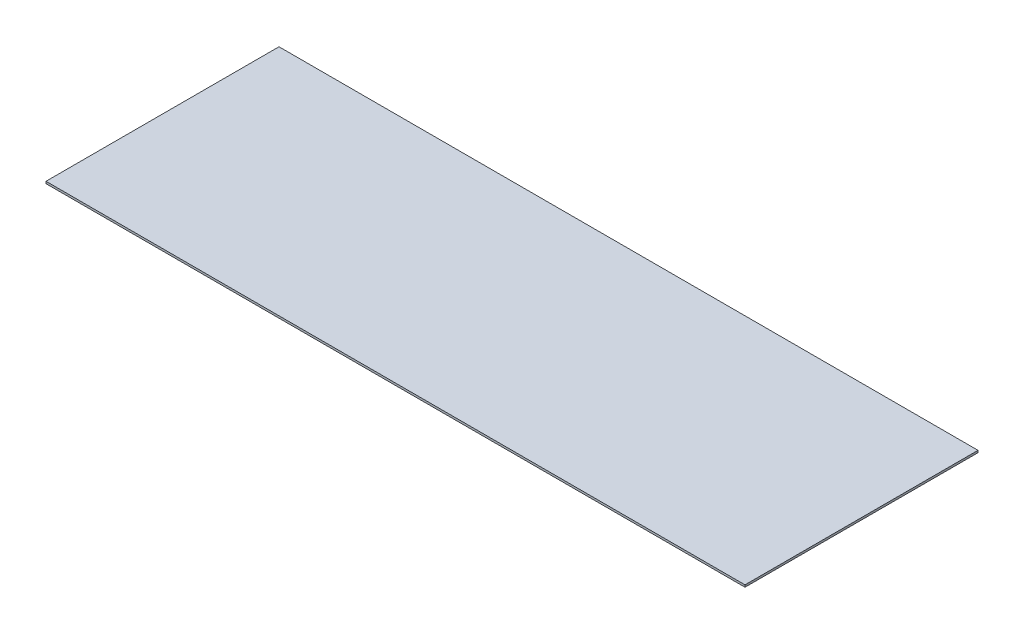
ISO-10303-21;
HEADER;
FILE_DESCRIPTION(('STEP AP214'),'2;1');
FILE_NAME('part.step','',(''),(''),'','','');
FILE_SCHEMA(('AUTOMOTIVE_DESIGN { 1 0 10303 214 1 1 1 1 }'));
ENDSEC;
DATA;
#1=APPLICATION_CONTEXT('core data for automotive mechanical design processes');
#2=APPLICATION_PROTOCOL_DEFINITION('international standard','automotive_design',2000,#1);
#3=PRODUCT_CONTEXT('',#1,'mechanical');
#4=PRODUCT('Part','Part','',(#3));
#5=PRODUCT_RELATED_PRODUCT_CATEGORY('part','',(#4));
#6=PRODUCT_DEFINITION_FORMATION('','',#4);
#7=PRODUCT_DEFINITION_CONTEXT('part definition',#1,'design');
#8=PRODUCT_DEFINITION('design','',#6,#7);
#9=PRODUCT_DEFINITION_SHAPE('','',#8);
#10=(LENGTH_UNIT() NAMED_UNIT(*) SI_UNIT(.MILLI.,.METRE.));
#11=(NAMED_UNIT(*) PLANE_ANGLE_UNIT() SI_UNIT($,.RADIAN.));
#12=(NAMED_UNIT(*) SI_UNIT($,.STERADIAN.) SOLID_ANGLE_UNIT());
#13=UNCERTAINTY_MEASURE_WITH_UNIT(LENGTH_MEASURE(1.E-05),#10,'distance_accuracy_value','');
#14=(GEOMETRIC_REPRESENTATION_CONTEXT(3) GLOBAL_UNCERTAINTY_ASSIGNED_CONTEXT((#13)) GLOBAL_UNIT_ASSIGNED_CONTEXT((#10,
#11,#12)) REPRESENTATION_CONTEXT('',''));
#15=CARTESIAN_POINT('',(0.,0.,0.));
#16=DIRECTION('',(0.,0.,1.));
#17=DIRECTION('',(1.,0.,0.));
#18=AXIS2_PLACEMENT_3D('',#15,#16,#17);
#19=CARTESIAN_POINT('',(-381.,2.286,0.));
#20=DIRECTION('',(0.,1.,0.));
#21=DIRECTION('',(0.,0.,1.));
#22=AXIS2_PLACEMENT_3D('',#19,#20,#21);
#23=PLANE('',#22);
#24=DIRECTION('',(-1.,0.,0.));
#25=VECTOR('',#24,1.);
#26=CARTESIAN_POINT('',(-381.,2.286,0.));
#27=LINE('',#26,#25);
#28=CARTESIAN_POINT('',(-381.,2.286,0.));
#29=VERTEX_POINT('',#28);
#30=CARTESIAN_POINT('',(381.,2.286,0.));
#31=VERTEX_POINT('',#30);
#32=EDGE_CURVE('E20',#29,#31,#27,.F.);
#33=ORIENTED_EDGE('',*,*,#32,.F.);
#34=DIRECTION('',(0.,0.,-1.));
#35=VECTOR('',#34,1.);
#36=CARTESIAN_POINT('',(-381.,2.286,0.));
#37=LINE('',#36,#35);
#38=CARTESIAN_POINT('',(-381.,2.286,254.));
#39=VERTEX_POINT('',#38);
#40=EDGE_CURVE('E80',#29,#39,#37,.F.);
#41=ORIENTED_EDGE('',*,*,#40,.T.);
#42=DIRECTION('',(1.,0.,0.));
#43=VECTOR('',#42,1.);
#44=CARTESIAN_POINT('',(-381.,2.286,254.));
#45=LINE('',#44,#43);
#46=CARTESIAN_POINT('',(381.,2.286,254.));
#47=VERTEX_POINT('',#46);
#48=EDGE_CURVE('E61',#47,#39,#45,.F.);
#49=ORIENTED_EDGE('',*,*,#48,.F.);
#50=DIRECTION('',(0.,0.,-1.));
#51=VECTOR('',#50,1.);
#52=CARTESIAN_POINT('',(381.,2.286,0.));
#53=LINE('',#52,#51);
#54=EDGE_CURVE('E56',#31,#47,#53,.F.);
#55=ORIENTED_EDGE('',*,*,#54,.F.);
#56=EDGE_LOOP('',(#33,#41,#49,#55));
#57=FACE_BOUND('',#56,.T.);
#58=ADVANCED_FACE('F17',(#57),#23,.T.);
#59=CARTESIAN_POINT('',(-381.,0.,0.));
#60=DIRECTION('',(0.,0.,-1.));
#61=DIRECTION('',(-1.,0.,0.));
#62=AXIS2_PLACEMENT_3D('',#59,#60,#61);
#63=PLANE('',#62);
#64=DIRECTION('',(1.,0.,0.));
#65=VECTOR('',#64,1.);
#66=CARTESIAN_POINT('',(-381.,0.,0.));
#67=LINE('',#66,#65);
#68=CARTESIAN_POINT('',(-381.,0.,0.));
#69=VERTEX_POINT('',#68);
#70=CARTESIAN_POINT('',(381.,0.,0.));
#71=VERTEX_POINT('',#70);
#72=EDGE_CURVE('E83',#69,#71,#67,.T.);
#73=ORIENTED_EDGE('',*,*,#72,.F.);
#74=DIRECTION('',(0.,1.,0.));
#75=VECTOR('',#74,1.);
#76=CARTESIAN_POINT('',(-381.,0.,0.));
#77=LINE('',#76,#75);
#78=EDGE_CURVE('E68',#69,#29,#77,.T.);
#79=ORIENTED_EDGE('',*,*,#78,.T.);
#80=ORIENTED_EDGE('',*,*,#32,.T.);
#81=DIRECTION('',(0.,1.,0.));
#82=VECTOR('',#81,1.);
#83=CARTESIAN_POINT('',(381.,0.,0.));
#84=LINE('',#83,#82);
#85=EDGE_CURVE('E63',#71,#31,#84,.T.);
#86=ORIENTED_EDGE('',*,*,#85,.F.);
#87=EDGE_LOOP('',(#73,#79,#80,#86));
#88=FACE_BOUND('',#87,.T.);
#89=ADVANCED_FACE('F65',(#88),#63,.T.);
#90=CARTESIAN_POINT('',(381.,0.,0.));
#91=DIRECTION('',(1.,0.,0.));
#92=DIRECTION('',(0.,0.,-1.));
#93=AXIS2_PLACEMENT_3D('',#90,#91,#92);
#94=PLANE('',#93);
#95=DIRECTION('',(0.,0.,-1.));
#96=VECTOR('',#95,1.);
#97=CARTESIAN_POINT('',(381.,0.,254.));
#98=LINE('',#97,#96);
#99=CARTESIAN_POINT('',(381.,0.,254.));
#100=VERTEX_POINT('',#99);
#101=EDGE_CURVE('E72',#71,#100,#98,.F.);
#102=ORIENTED_EDGE('',*,*,#101,.F.);
#103=ORIENTED_EDGE('',*,*,#85,.T.);
#104=ORIENTED_EDGE('',*,*,#54,.T.);
#105=DIRECTION('',(0.,1.,0.));
#106=VECTOR('',#105,1.);
#107=CARTESIAN_POINT('',(381.,2.286,254.));
#108=LINE('',#107,#106);
#109=EDGE_CURVE('E74',#100,#47,#108,.T.);
#110=ORIENTED_EDGE('',*,*,#109,.F.);
#111=EDGE_LOOP('',(#102,#103,#104,#110));
#112=FACE_BOUND('',#111,.T.);
#113=ADVANCED_FACE('F70',(#112),#94,.T.);
#114=CARTESIAN_POINT('',(-381.,2.286,254.));
#115=DIRECTION('',(0.,0.,1.));
#116=DIRECTION('',(1.,0.,0.));
#117=AXIS2_PLACEMENT_3D('',#114,#115,#116);
#118=PLANE('',#117);
#119=ORIENTED_EDGE('',*,*,#48,.T.);
#120=DIRECTION('',(0.,1.,0.));
#121=VECTOR('',#120,1.);
#122=CARTESIAN_POINT('',(-381.,0.,254.));
#123=LINE('',#122,#121);
#124=CARTESIAN_POINT('',(-381.,0.,254.));
#125=VERTEX_POINT('',#124);
#126=EDGE_CURVE('E35',#39,#125,#123,.F.);
#127=ORIENTED_EDGE('',*,*,#126,.T.);
#128=DIRECTION('',(1.,0.,0.));
#129=VECTOR('',#128,1.);
#130=CARTESIAN_POINT('',(-381.,0.,254.));
#131=LINE('',#130,#129);
#132=EDGE_CURVE('E26',#100,#125,#131,.F.);
#133=ORIENTED_EDGE('',*,*,#132,.F.);
#134=ORIENTED_EDGE('',*,*,#109,.T.);
#135=EDGE_LOOP('',(#119,#127,#133,#134));
#136=FACE_BOUND('',#135,.T.);
#137=ADVANCED_FACE('F89',(#136),#118,.T.);
#138=CARTESIAN_POINT('',(-381.,0.,0.));
#139=DIRECTION('',(1.,0.,0.));
#140=DIRECTION('',(0.,0.,-1.));
#141=AXIS2_PLACEMENT_3D('',#138,#139,#140);
#142=PLANE('',#141);
#143=ORIENTED_EDGE('',*,*,#126,.F.);
#144=ORIENTED_EDGE('',*,*,#40,.F.);
#145=ORIENTED_EDGE('',*,*,#78,.F.);
#146=DIRECTION('',(0.,0.,-1.));
#147=VECTOR('',#146,1.);
#148=CARTESIAN_POINT('',(-381.,0.,254.));
#149=LINE('',#148,#147);
#150=EDGE_CURVE('E11',#125,#69,#149,.T.);
#151=ORIENTED_EDGE('',*,*,#150,.F.);
#152=EDGE_LOOP('',(#143,#144,#145,#151));
#153=FACE_BOUND('',#152,.T.);
#154=ADVANCED_FACE('F91',(#153),#142,.F.);
#155=CARTESIAN_POINT('',(-381.,0.,254.));
#156=DIRECTION('',(0.,-1.,0.));
#157=DIRECTION('',(0.,0.,-1.));
#158=AXIS2_PLACEMENT_3D('',#155,#156,#157);
#159=PLANE('',#158);
#160=ORIENTED_EDGE('',*,*,#132,.T.);
#161=ORIENTED_EDGE('',*,*,#150,.T.);
#162=ORIENTED_EDGE('',*,*,#72,.T.);
#163=ORIENTED_EDGE('',*,*,#101,.T.);
#164=EDGE_LOOP('',(#160,#161,#162,#163));
#165=FACE_BOUND('',#164,.T.);
#166=ADVANCED_FACE('F88',(#165),#159,.T.);
#167=CLOSED_SHELL('',(#58,#89,#113,#137,#154,#166));
#168=MANIFOLD_SOLID_BREP('B1',#167);
#169=ADVANCED_BREP_SHAPE_REPRESENTATION('',(#18,#168),#14);
#170=SHAPE_DEFINITION_REPRESENTATION(#9,#169);
ENDSEC;
END-ISO-10303-21;
